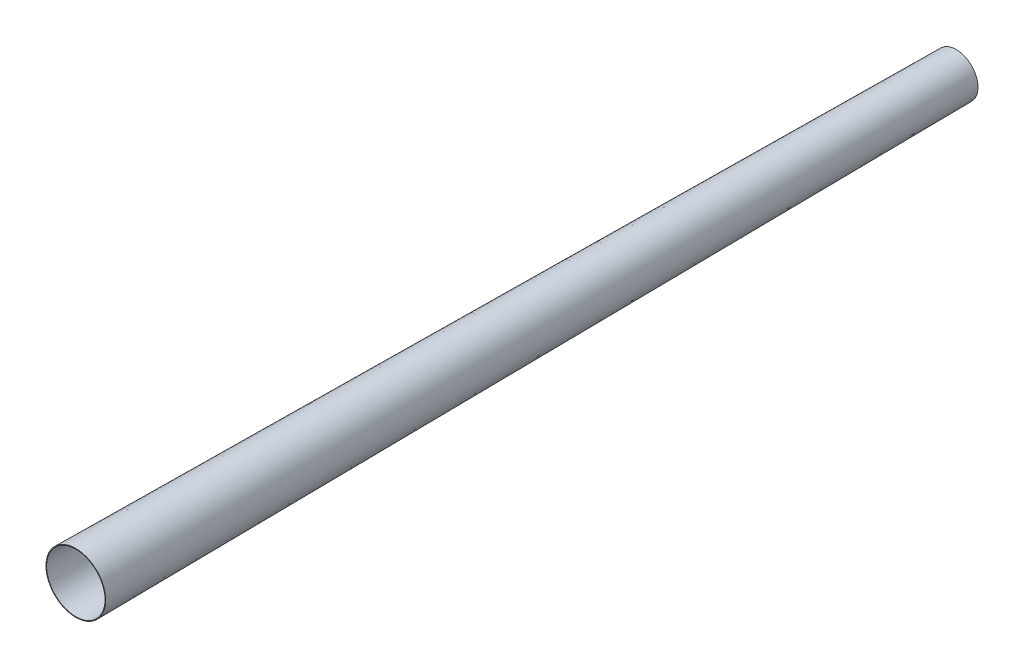
ISO-10303-21;
HEADER;
FILE_DESCRIPTION(('STEP AP214'),'2;1');
FILE_NAME('part.step','',(''),(''),'','','');
FILE_SCHEMA(('AUTOMOTIVE_DESIGN { 1 0 10303 214 1 1 1 1 }'));
ENDSEC;
DATA;
#1=APPLICATION_CONTEXT('core data for automotive mechanical design processes');
#2=APPLICATION_PROTOCOL_DEFINITION('international standard','automotive_design',2000,#1);
#3=PRODUCT_CONTEXT('',#1,'mechanical');
#4=PRODUCT('Part','Part','',(#3));
#5=PRODUCT_RELATED_PRODUCT_CATEGORY('part','',(#4));
#6=PRODUCT_DEFINITION_FORMATION('','',#4);
#7=PRODUCT_DEFINITION_CONTEXT('part definition',#1,'design');
#8=PRODUCT_DEFINITION('design','',#6,#7);
#9=PRODUCT_DEFINITION_SHAPE('','',#8);
#10=(LENGTH_UNIT() NAMED_UNIT(*) SI_UNIT(.MILLI.,.METRE.));
#11=(NAMED_UNIT(*) PLANE_ANGLE_UNIT() SI_UNIT($,.RADIAN.));
#12=(NAMED_UNIT(*) SI_UNIT($,.STERADIAN.) SOLID_ANGLE_UNIT());
#13=UNCERTAINTY_MEASURE_WITH_UNIT(LENGTH_MEASURE(1.E-05),#10,'distance_accuracy_value','');
#14=(GEOMETRIC_REPRESENTATION_CONTEXT(3) GLOBAL_UNCERTAINTY_ASSIGNED_CONTEXT((#13)) GLOBAL_UNIT_ASSIGNED_CONTEXT((#10,
#11,#12)) REPRESENTATION_CONTEXT('',''));
#15=CARTESIAN_POINT('',(0.,0.,0.));
#16=DIRECTION('',(0.,0.,1.));
#17=DIRECTION('',(1.,0.,0.));
#18=AXIS2_PLACEMENT_3D('',#15,#16,#17);
#19=CARTESIAN_POINT('',(0.,0.,700.99461252));
#20=DIRECTION('',(0.,0.,1.));
#21=DIRECTION('',(1.,0.,0.));
#22=AXIS2_PLACEMENT_3D('',#19,#20,#21);
#23=PLANE('',#22);
#24=CARTESIAN_POINT('',(0.,0.,700.99461252));
#25=DIRECTION('',(0.,0.,1.));
#26=DIRECTION('',(1.,0.,0.));
#27=AXIS2_PLACEMENT_3D('',#24,#25,#26);
#28=CIRCLE('',#27,23.2750462939441);
#29=CARTESIAN_POINT('',(23.2750462939441,0.,700.99461252));
#30=VERTEX_POINT('',#29);
#31=EDGE_CURVE('E54',#30,#30,#28,.T.);
#32=ORIENTED_EDGE('',*,*,#31,.F.);
#33=EDGE_LOOP('',(#32));
#34=FACE_BOUND('',#33,.T.);
#35=CARTESIAN_POINT('',(0.,0.,700.99461252));
#36=DIRECTION('',(0.,0.,1.));
#37=DIRECTION('',(1.,0.,0.));
#38=AXIS2_PLACEMENT_3D('',#35,#36,#37);
#39=CIRCLE('',#38,23.7750671904073);
#40=CARTESIAN_POINT('',(23.7750671904073,0.,700.99461252));
#41=VERTEX_POINT('',#40);
#42=EDGE_CURVE('E11',#41,#41,#39,.T.);
#43=ORIENTED_EDGE('',*,*,#42,.T.);
#44=EDGE_LOOP('',(#43));
#45=FACE_BOUND('',#44,.T.);
#46=ADVANCED_FACE('F39',(#34,#45),#23,.T.);
#47=CARTESIAN_POINT('',(0.,0.,0.));
#48=DIRECTION('',(0.,0.,1.));
#49=DIRECTION('',(1.,0.,0.));
#50=AXIS2_PLACEMENT_3D('',#47,#48,#49);
#51=PLANE('',#50);
#52=CARTESIAN_POINT('',(0.,0.,0.));
#53=DIRECTION('',(0.,0.,1.));
#54=DIRECTION('',(1.,0.,0.));
#55=AXIS2_PLACEMENT_3D('',#52,#53,#54);
#56=CIRCLE('',#55,16.8661151382691);
#57=CARTESIAN_POINT('',(16.8661151382691,0.,0.));
#58=VERTEX_POINT('',#57);
#59=EDGE_CURVE('E111',#58,#58,#56,.T.);
#60=ORIENTED_EDGE('',*,*,#59,.T.);
#61=EDGE_LOOP('',(#60));
#62=FACE_BOUND('',#61,.T.);
#63=CARTESIAN_POINT('',(0.,0.,0.));
#64=DIRECTION('',(0.,0.,1.));
#65=DIRECTION('',(1.,0.,0.));
#66=AXIS2_PLACEMENT_3D('',#63,#64,#65);
#67=CIRCLE('',#66,17.3661360347323);
#68=CARTESIAN_POINT('',(17.3661360347323,0.,0.));
#69=VERTEX_POINT('',#68);
#70=EDGE_CURVE('E48',#69,#69,#67,.T.);
#71=ORIENTED_EDGE('',*,*,#70,.F.);
#72=EDGE_LOOP('',(#71));
#73=FACE_BOUND('',#72,.T.);
#74=ADVANCED_FACE('F73',(#62,#73),#51,.F.);
#75=CARTESIAN_POINT('',(0.,0.,0.));
#76=DIRECTION('',(0.,0.,1.));
#77=DIRECTION('',(1.,0.,0.));
#78=AXIS2_PLACEMENT_3D('',#75,#76,#77);
#79=CONICAL_SURFACE('',#78,17.3661360347323,0.00914237068461168);
#80=ORIENTED_EDGE('',*,*,#70,.T.);
#81=EDGE_LOOP('',(#80));
#82=FACE_BOUND('',#81,.T.);
#83=ORIENTED_EDGE('',*,*,#42,.F.);
#84=EDGE_LOOP('',(#83));
#85=FACE_BOUND('',#84,.T.);
#86=ADVANCED_FACE('F82',(#82,#85),#79,.T.);
#87=CARTESIAN_POINT('',(0.,0.,0.00457112166371894));
#88=DIRECTION('',(0.,0.,1.));
#89=DIRECTION('',(1.,0.,0.));
#90=AXIS2_PLACEMENT_3D('',#87,#88,#89);
#91=CONICAL_SURFACE('',#90,16.8661569303222,0.00914237068461168);
#92=ORIENTED_EDGE('',*,*,#59,.F.);
#93=EDGE_LOOP('',(#92));
#94=FACE_BOUND('',#93,.T.);
#95=ORIENTED_EDGE('',*,*,#31,.T.);
#96=EDGE_LOOP('',(#95));
#97=FACE_BOUND('',#96,.T.);
#98=ADVANCED_FACE('F84',(#94,#97),#91,.F.);
#99=CLOSED_SHELL('',(#46,#74,#86,#98));
#100=MANIFOLD_SOLID_BREP('B2',#99);
#101=ADVANCED_BREP_SHAPE_REPRESENTATION('',(#18,#100),#14);
#102=SHAPE_DEFINITION_REPRESENTATION(#9,#101);
ENDSEC;
END-ISO-10303-21;
